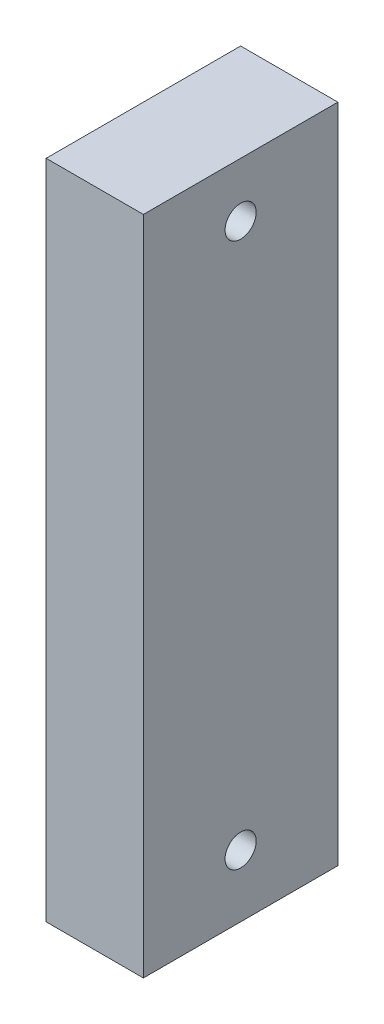
ISO-10303-21;
HEADER;
FILE_DESCRIPTION(('STEP AP214'),'2;1');
FILE_NAME('part.step','',(''),(''),'','','');
FILE_SCHEMA(('AUTOMOTIVE_DESIGN { 1 0 10303 214 1 1 1 1 }'));
ENDSEC;
DATA;
#1=APPLICATION_CONTEXT('core data for automotive mechanical design processes');
#2=APPLICATION_PROTOCOL_DEFINITION('international standard','automotive_design',2000,#1);
#3=PRODUCT_CONTEXT('',#1,'mechanical');
#4=PRODUCT('Part','Part','',(#3));
#5=PRODUCT_RELATED_PRODUCT_CATEGORY('part','',(#4));
#6=PRODUCT_DEFINITION_FORMATION('','',#4);
#7=PRODUCT_DEFINITION_CONTEXT('part definition',#1,'design');
#8=PRODUCT_DEFINITION('design','',#6,#7);
#9=PRODUCT_DEFINITION_SHAPE('','',#8);
#10=(LENGTH_UNIT() NAMED_UNIT(*) SI_UNIT(.MILLI.,.METRE.));
#11=(NAMED_UNIT(*) PLANE_ANGLE_UNIT() SI_UNIT($,.RADIAN.));
#12=(NAMED_UNIT(*) SI_UNIT($,.STERADIAN.) SOLID_ANGLE_UNIT());
#13=UNCERTAINTY_MEASURE_WITH_UNIT(LENGTH_MEASURE(1.E-05),#10,'distance_accuracy_value','');
#14=(GEOMETRIC_REPRESENTATION_CONTEXT(3) GLOBAL_UNCERTAINTY_ASSIGNED_CONTEXT((#13)) GLOBAL_UNIT_ASSIGNED_CONTEXT((#10,
#11,#12)) REPRESENTATION_CONTEXT('',''));
#15=CARTESIAN_POINT('',(0.,0.,0.));
#16=DIRECTION('',(0.,0.,1.));
#17=DIRECTION('',(1.,0.,0.));
#18=AXIS2_PLACEMENT_3D('',#15,#16,#17);
#19=CARTESIAN_POINT('',(0.,0.,50.));
#20=DIRECTION('',(1.,0.,0.));
#21=DIRECTION('',(0.,0.,-1.));
#22=AXIS2_PLACEMENT_3D('',#19,#20,#21);
#23=PLANE('',#22);
#24=CARTESIAN_POINT('',(0.,156.,24.9999999999995));
#25=DIRECTION('',(-1.,0.,0.));
#26=DIRECTION('',(0.,0.,1.));
#27=AXIS2_PLACEMENT_3D('',#24,#25,#26);
#28=CIRCLE('',#27,4.);
#29=CARTESIAN_POINT('',(0.,156.,28.9999999999995));
#30=VERTEX_POINT('',#29);
#31=EDGE_CURVE('E116',#30,#30,#28,.T.);
#32=ORIENTED_EDGE('',*,*,#31,.F.);
#33=EDGE_LOOP('',(#32));
#34=FACE_BOUND('',#33,.T.);
#35=CARTESIAN_POINT('',(0.,16.,25.));
#36=DIRECTION('',(-1.,0.,0.));
#37=DIRECTION('',(0.,0.,1.));
#38=AXIS2_PLACEMENT_3D('',#35,#36,#37);
#39=CIRCLE('',#38,4.);
#40=CARTESIAN_POINT('',(0.,16.,29.));
#41=VERTEX_POINT('',#40);
#42=EDGE_CURVE('E110',#41,#41,#39,.T.);
#43=ORIENTED_EDGE('',*,*,#42,.F.);
#44=EDGE_LOOP('',(#43));
#45=FACE_BOUND('',#44,.T.);
#46=DIRECTION('',(0.,-1.,0.));
#47=VECTOR('',#46,1.);
#48=CARTESIAN_POINT('',(0.,0.,0.));
#49=LINE('',#48,#47);
#50=CARTESIAN_POINT('',(0.,170.,0.));
#51=VERTEX_POINT('',#50);
#52=CARTESIAN_POINT('',(0.,0.,0.));
#53=VERTEX_POINT('',#52);
#54=EDGE_CURVE('E96',#51,#53,#49,.T.);
#55=ORIENTED_EDGE('',*,*,#54,.T.);
#56=DIRECTION('',(0.,0.,-1.));
#57=VECTOR('',#56,1.);
#58=CARTESIAN_POINT('',(0.,0.,50.));
#59=LINE('',#58,#57);
#60=CARTESIAN_POINT('',(0.,0.,50.));
#61=VERTEX_POINT('',#60);
#62=EDGE_CURVE('E11',#61,#53,#59,.T.);
#63=ORIENTED_EDGE('',*,*,#62,.F.);
#64=DIRECTION('',(0.,-1.,0.));
#65=VECTOR('',#64,1.);
#66=CARTESIAN_POINT('',(0.,0.,50.));
#67=LINE('',#66,#65);
#68=CARTESIAN_POINT('',(0.,170.,50.));
#69=VERTEX_POINT('',#68);
#70=EDGE_CURVE('E84',#69,#61,#67,.T.);
#71=ORIENTED_EDGE('',*,*,#70,.F.);
#72=DIRECTION('',(0.,0.,-1.));
#73=VECTOR('',#72,1.);
#74=CARTESIAN_POINT('',(0.,170.,50.));
#75=LINE('',#74,#73);
#76=EDGE_CURVE('E92',#69,#51,#75,.T.);
#77=ORIENTED_EDGE('',*,*,#76,.T.);
#78=EDGE_LOOP('',(#55,#63,#71,#77));
#79=FACE_BOUND('',#78,.T.);
#80=ADVANCED_FACE('F33',(#34,#45,#79),#23,.F.);
#81=CARTESIAN_POINT('',(0.,0.,50.));
#82=DIRECTION('',(0.,1.,0.));
#83=DIRECTION('',(0.,0.,1.));
#84=AXIS2_PLACEMENT_3D('',#81,#82,#83);
#85=PLANE('',#84);
#86=DIRECTION('',(1.,0.,0.));
#87=VECTOR('',#86,1.);
#88=CARTESIAN_POINT('',(0.,0.,0.));
#89=LINE('',#88,#87);
#90=CARTESIAN_POINT('',(25.,0.,0.));
#91=VERTEX_POINT('',#90);
#92=EDGE_CURVE('E88',#53,#91,#89,.T.);
#93=ORIENTED_EDGE('',*,*,#92,.T.);
#94=DIRECTION('',(0.,0.,-1.));
#95=VECTOR('',#94,1.);
#96=CARTESIAN_POINT('',(25.,0.,50.));
#97=LINE('',#96,#95);
#98=CARTESIAN_POINT('',(25.,0.,50.));
#99=VERTEX_POINT('',#98);
#100=EDGE_CURVE('E41',#99,#91,#97,.T.);
#101=ORIENTED_EDGE('',*,*,#100,.F.);
#102=DIRECTION('',(1.,0.,0.));
#103=VECTOR('',#102,1.);
#104=CARTESIAN_POINT('',(0.,0.,50.));
#105=LINE('',#104,#103);
#106=EDGE_CURVE('E79',#61,#99,#105,.T.);
#107=ORIENTED_EDGE('',*,*,#106,.F.);
#108=ORIENTED_EDGE('',*,*,#62,.T.);
#109=EDGE_LOOP('',(#93,#101,#107,#108));
#110=FACE_BOUND('',#109,.T.);
#111=ADVANCED_FACE('F87',(#110),#85,.F.);
#112=CARTESIAN_POINT('',(25.,0.,50.));
#113=DIRECTION('',(-1.,0.,0.));
#114=DIRECTION('',(0.,-1.,0.));
#115=AXIS2_PLACEMENT_3D('',#112,#113,#114);
#116=PLANE('',#115);
#117=CARTESIAN_POINT('',(25.,156.,24.9999999999995));
#118=DIRECTION('',(-1.,0.,0.));
#119=DIRECTION('',(0.,0.,1.));
#120=AXIS2_PLACEMENT_3D('',#117,#118,#119);
#121=CIRCLE('',#120,4.);
#122=CARTESIAN_POINT('',(25.,156.,28.9999999999995));
#123=VERTEX_POINT('',#122);
#124=EDGE_CURVE('E113',#123,#123,#121,.T.);
#125=ORIENTED_EDGE('',*,*,#124,.T.);
#126=EDGE_LOOP('',(#125));
#127=FACE_BOUND('',#126,.T.);
#128=CARTESIAN_POINT('',(25.,16.,25.));
#129=DIRECTION('',(-1.,0.,0.));
#130=DIRECTION('',(0.,0.,1.));
#131=AXIS2_PLACEMENT_3D('',#128,#129,#130);
#132=CIRCLE('',#131,4.);
#133=CARTESIAN_POINT('',(25.,16.,29.));
#134=VERTEX_POINT('',#133);
#135=EDGE_CURVE('E99',#134,#134,#132,.T.);
#136=ORIENTED_EDGE('',*,*,#135,.T.);
#137=EDGE_LOOP('',(#136));
#138=FACE_BOUND('',#137,.T.);
#139=DIRECTION('',(0.,1.,0.));
#140=VECTOR('',#139,1.);
#141=CARTESIAN_POINT('',(25.,0.,0.));
#142=LINE('',#141,#140);
#143=CARTESIAN_POINT('',(25.,170.,0.));
#144=VERTEX_POINT('',#143);
#145=EDGE_CURVE('E66',#91,#144,#142,.T.);
#146=ORIENTED_EDGE('',*,*,#145,.T.);
#147=DIRECTION('',(0.,0.,-1.));
#148=VECTOR('',#147,1.);
#149=CARTESIAN_POINT('',(25.,170.,50.));
#150=LINE('',#149,#148);
#151=CARTESIAN_POINT('',(25.,170.,50.));
#152=VERTEX_POINT('',#151);
#153=EDGE_CURVE('E89',#152,#144,#150,.T.);
#154=ORIENTED_EDGE('',*,*,#153,.F.);
#155=DIRECTION('',(0.,1.,0.));
#156=VECTOR('',#155,1.);
#157=CARTESIAN_POINT('',(25.,0.,50.));
#158=LINE('',#157,#156);
#159=EDGE_CURVE('E82',#99,#152,#158,.T.);
#160=ORIENTED_EDGE('',*,*,#159,.F.);
#161=ORIENTED_EDGE('',*,*,#100,.T.);
#162=EDGE_LOOP('',(#146,#154,#160,#161));
#163=FACE_BOUND('',#162,.T.);
#164=ADVANCED_FACE('F90',(#127,#138,#163),#116,.F.);
#165=CARTESIAN_POINT('',(0.,170.,50.));
#166=DIRECTION('',(0.,-1.,0.));
#167=DIRECTION('',(0.,0.,-1.));
#168=AXIS2_PLACEMENT_3D('',#165,#166,#167);
#169=PLANE('',#168);
#170=DIRECTION('',(-1.,0.,0.));
#171=VECTOR('',#170,1.);
#172=CARTESIAN_POINT('',(0.,170.,0.));
#173=LINE('',#172,#171);
#174=EDGE_CURVE('E72',#144,#51,#173,.T.);
#175=ORIENTED_EDGE('',*,*,#174,.T.);
#176=ORIENTED_EDGE('',*,*,#76,.F.);
#177=DIRECTION('',(-1.,0.,0.));
#178=VECTOR('',#177,1.);
#179=CARTESIAN_POINT('',(0.,170.,50.));
#180=LINE('',#179,#178);
#181=EDGE_CURVE('E49',#152,#69,#180,.T.);
#182=ORIENTED_EDGE('',*,*,#181,.F.);
#183=ORIENTED_EDGE('',*,*,#153,.T.);
#184=EDGE_LOOP('',(#175,#176,#182,#183));
#185=FACE_BOUND('',#184,.T.);
#186=ADVANCED_FACE('F104',(#185),#169,.F.);
#187=CARTESIAN_POINT('',(0.,0.,50.));
#188=DIRECTION('',(0.,0.,-1.));
#189=DIRECTION('',(-1.,0.,0.));
#190=AXIS2_PLACEMENT_3D('',#187,#188,#189);
#191=PLANE('',#190);
#192=ORIENTED_EDGE('',*,*,#70,.T.);
#193=ORIENTED_EDGE('',*,*,#106,.T.);
#194=ORIENTED_EDGE('',*,*,#159,.T.);
#195=ORIENTED_EDGE('',*,*,#181,.T.);
#196=EDGE_LOOP('',(#192,#193,#194,#195));
#197=FACE_BOUND('',#196,.T.);
#198=ADVANCED_FACE('F80',(#197),#191,.F.);
#199=CARTESIAN_POINT('',(0.,0.,0.));
#200=DIRECTION('',(0.,0.,-1.));
#201=DIRECTION('',(-1.,0.,0.));
#202=AXIS2_PLACEMENT_3D('',#199,#200,#201);
#203=PLANE('',#202);
#204=ORIENTED_EDGE('',*,*,#54,.F.);
#205=ORIENTED_EDGE('',*,*,#174,.F.);
#206=ORIENTED_EDGE('',*,*,#145,.F.);
#207=ORIENTED_EDGE('',*,*,#92,.F.);
#208=EDGE_LOOP('',(#204,#205,#206,#207));
#209=FACE_BOUND('',#208,.T.);
#210=ADVANCED_FACE('F107',(#209),#203,.T.);
#211=CARTESIAN_POINT('',(25.,16.,25.));
#212=DIRECTION('',(-1.,0.,0.));
#213=DIRECTION('',(0.,0.,1.));
#214=AXIS2_PLACEMENT_3D('',#211,#212,#213);
#215=CYLINDRICAL_SURFACE('',#214,4.);
#216=CARTESIAN_POINT('',(25.,16.,29.));
#217=CARTESIAN_POINT('',(24.7395833333333,16.,29.));
#218=CARTESIAN_POINT('',(24.4791666666667,16.,29.));
#219=CARTESIAN_POINT('',(23.9583333333333,16.,29.));
#220=CARTESIAN_POINT('',(23.6979166666667,16.,29.));
#221=CARTESIAN_POINT('',(23.1770833333333,16.,29.));
#222=CARTESIAN_POINT('',(22.9166666666667,16.,29.));
#223=CARTESIAN_POINT('',(22.3958333333333,16.,29.));
#224=CARTESIAN_POINT('',(22.1354166666667,16.,29.));
#225=CARTESIAN_POINT('',(21.6145833333333,16.,29.));
#226=CARTESIAN_POINT('',(21.3541666666667,16.,29.));
#227=CARTESIAN_POINT('',(20.8333333333333,16.,29.));
#228=CARTESIAN_POINT('',(20.5729166666667,16.,29.));
#229=CARTESIAN_POINT('',(20.0520833333333,16.,29.));
#230=CARTESIAN_POINT('',(19.7916666666667,16.,29.));
#231=CARTESIAN_POINT('',(19.2708333333333,16.,29.));
#232=CARTESIAN_POINT('',(19.0104166666667,16.,29.));
#233=CARTESIAN_POINT('',(18.4895833333333,16.,29.));
#234=CARTESIAN_POINT('',(18.2291666666667,16.,29.));
#235=CARTESIAN_POINT('',(17.7083333333333,16.,29.));
#236=CARTESIAN_POINT('',(17.4479166666667,16.,29.));
#237=CARTESIAN_POINT('',(16.9270833333333,16.,29.));
#238=CARTESIAN_POINT('',(16.6666666666667,16.,29.));
#239=CARTESIAN_POINT('',(16.1458333333333,16.,29.));
#240=CARTESIAN_POINT('',(15.8854166666667,16.,29.));
#241=CARTESIAN_POINT('',(15.3645833333333,16.,29.));
#242=CARTESIAN_POINT('',(15.1041666666667,16.,29.));
#243=CARTESIAN_POINT('',(14.5833333333333,16.,29.));
#244=CARTESIAN_POINT('',(14.3229166666667,16.,29.));
#245=CARTESIAN_POINT('',(13.8020833333333,16.,29.));
#246=CARTESIAN_POINT('',(13.5416666666667,16.,29.));
#247=CARTESIAN_POINT('',(13.0208333333333,16.,29.));
#248=CARTESIAN_POINT('',(12.7604166666667,16.,29.));
#249=CARTESIAN_POINT('',(12.2395833333333,16.,29.));
#250=CARTESIAN_POINT('',(11.9791666666667,16.,29.));
#251=CARTESIAN_POINT('',(11.4583333333333,16.,29.));
#252=CARTESIAN_POINT('',(11.1979166666667,16.,29.));
#253=CARTESIAN_POINT('',(10.6770833333333,16.,29.));
#254=CARTESIAN_POINT('',(10.4166666666667,16.,29.));
#255=CARTESIAN_POINT('',(9.89583333333333,16.,29.));
#256=CARTESIAN_POINT('',(9.63541666666667,16.,29.));
#257=CARTESIAN_POINT('',(9.11458333333333,16.,29.));
#258=CARTESIAN_POINT('',(8.85416666666667,16.,29.));
#259=CARTESIAN_POINT('',(8.33333333333333,16.,29.));
#260=CARTESIAN_POINT('',(8.07291666666667,16.,29.));
#261=CARTESIAN_POINT('',(7.55208333333333,16.,29.));
#262=CARTESIAN_POINT('',(7.29166666666667,16.,29.));
#263=CARTESIAN_POINT('',(6.77083333333333,16.,29.));
#264=CARTESIAN_POINT('',(6.51041666666667,16.,29.));
#265=CARTESIAN_POINT('',(5.98958333333333,16.,29.));
#266=CARTESIAN_POINT('',(5.72916666666667,16.,29.));
#267=CARTESIAN_POINT('',(5.20833333333333,16.,29.));
#268=CARTESIAN_POINT('',(4.94791666666667,16.,29.));
#269=CARTESIAN_POINT('',(4.42708333333333,16.,29.));
#270=CARTESIAN_POINT('',(4.16666666666667,16.,29.));
#271=CARTESIAN_POINT('',(3.64583333333333,16.,29.));
#272=CARTESIAN_POINT('',(3.38541666666667,16.,29.));
#273=CARTESIAN_POINT('',(2.86458333333333,16.,29.));
#274=CARTESIAN_POINT('',(2.60416666666667,16.,29.));
#275=CARTESIAN_POINT('',(2.08333333333333,16.,29.));
#276=CARTESIAN_POINT('',(1.82291666666667,16.,29.));
#277=CARTESIAN_POINT('',(1.30208333333333,16.,29.));
#278=CARTESIAN_POINT('',(1.04166666666667,16.,29.));
#279=CARTESIAN_POINT('',(0.520833333333334,16.,29.));
#280=CARTESIAN_POINT('',(0.260416666666667,16.,29.));
#281=CARTESIAN_POINT('',(0.,16.,29.));
#282=B_SPLINE_CURVE_WITH_KNOTS('',3,(#216,#217,#218,#219,#220,#221,#222,#223,#224,#225,#226,
#227,#228,#229,#230,#231,#232,#233,#234,#235,#236,#237,#238,#239,#240,#241,#242,#243,#244,#245,
#246,#247,#248,#249,#250,#251,#252,#253,#254,#255,#256,#257,#258,#259,#260,#261,#262,#263,#264,
#265,#266,#267,#268,#269,#270,#271,#272,#273,#274,#275,#276,#277,#278,#279,#280,#281),
.UNSPECIFIED.,.F.,.F.,(4,2,2,2,2,2,2,2,2,2,2,2,2,2,2,2,2,2,2,2,2,2,2,2,2,2,2,2,2,2,2,2,4),(0.,
0.781249999999997,1.5625,2.34375,3.125,3.90625,4.6875,5.46875,6.25,7.03125,7.8125,8.59375,9.375,
10.15625,10.9375,11.71875,12.5,13.28125,14.0625,14.84375,15.625,16.40625,17.1875,17.96875,18.75,
19.53125,20.3125,21.09375,21.875,22.65625,23.4375,24.21875,25.),.UNSPECIFIED.);
#283=EDGE_CURVE('BSEAM127',#134,#41,#282,.T.);
#284=ORIENTED_EDGE('',*,*,#135,.F.);
#285=ORIENTED_EDGE('',*,*,#42,.T.);
#286=ORIENTED_EDGE('',*,*,#283,.T.);
#287=ORIENTED_EDGE('',*,*,#283,.F.);
#288=EDGE_LOOP('',(#284,#286,#285,#287));
#289=FACE_BOUND('',#288,.T.);
#290=ADVANCED_FACE('F127',(#289),#215,.F.);
#291=CARTESIAN_POINT('',(25.,156.,24.9999999999995));
#292=DIRECTION('',(-1.,0.,0.));
#293=DIRECTION('',(0.,0.,1.));
#294=AXIS2_PLACEMENT_3D('',#291,#292,#293);
#295=CYLINDRICAL_SURFACE('',#294,4.);
#296=CARTESIAN_POINT('',(25.,156.,28.9999999999995));
#297=CARTESIAN_POINT('',(24.7395833333333,156.,28.9999999999995));
#298=CARTESIAN_POINT('',(24.4791666666667,156.,28.9999999999995));
#299=CARTESIAN_POINT('',(23.9583333333333,156.,28.9999999999995));
#300=CARTESIAN_POINT('',(23.6979166666667,156.,28.9999999999995));
#301=CARTESIAN_POINT('',(23.1770833333333,156.,28.9999999999995));
#302=CARTESIAN_POINT('',(22.9166666666667,156.,28.9999999999995));
#303=CARTESIAN_POINT('',(22.3958333333333,156.,28.9999999999995));
#304=CARTESIAN_POINT('',(22.1354166666667,156.,28.9999999999995));
#305=CARTESIAN_POINT('',(21.6145833333333,156.,28.9999999999995));
#306=CARTESIAN_POINT('',(21.3541666666667,156.,28.9999999999995));
#307=CARTESIAN_POINT('',(20.8333333333333,156.,28.9999999999995));
#308=CARTESIAN_POINT('',(20.5729166666667,156.,28.9999999999995));
#309=CARTESIAN_POINT('',(20.0520833333333,156.,28.9999999999995));
#310=CARTESIAN_POINT('',(19.7916666666667,156.,28.9999999999995));
#311=CARTESIAN_POINT('',(19.2708333333333,156.,28.9999999999995));
#312=CARTESIAN_POINT('',(19.0104166666667,156.,28.9999999999995));
#313=CARTESIAN_POINT('',(18.4895833333333,156.,28.9999999999995));
#314=CARTESIAN_POINT('',(18.2291666666667,156.,28.9999999999995));
#315=CARTESIAN_POINT('',(17.7083333333333,156.,28.9999999999995));
#316=CARTESIAN_POINT('',(17.4479166666667,156.,28.9999999999995));
#317=CARTESIAN_POINT('',(16.9270833333333,156.,28.9999999999995));
#318=CARTESIAN_POINT('',(16.6666666666667,156.,28.9999999999995));
#319=CARTESIAN_POINT('',(16.1458333333333,156.,28.9999999999995));
#320=CARTESIAN_POINT('',(15.8854166666667,156.,28.9999999999995));
#321=CARTESIAN_POINT('',(15.3645833333333,156.,28.9999999999995));
#322=CARTESIAN_POINT('',(15.1041666666667,156.,28.9999999999995));
#323=CARTESIAN_POINT('',(14.5833333333333,156.,28.9999999999995));
#324=CARTESIAN_POINT('',(14.3229166666667,156.,28.9999999999995));
#325=CARTESIAN_POINT('',(13.8020833333333,156.,28.9999999999995));
#326=CARTESIAN_POINT('',(13.5416666666667,156.,28.9999999999995));
#327=CARTESIAN_POINT('',(13.0208333333333,156.,28.9999999999995));
#328=CARTESIAN_POINT('',(12.7604166666667,156.,28.9999999999995));
#329=CARTESIAN_POINT('',(12.2395833333333,156.,28.9999999999995));
#330=CARTESIAN_POINT('',(11.9791666666667,156.,28.9999999999995));
#331=CARTESIAN_POINT('',(11.4583333333333,156.,28.9999999999995));
#332=CARTESIAN_POINT('',(11.1979166666667,156.,28.9999999999995));
#333=CARTESIAN_POINT('',(10.6770833333333,156.,28.9999999999995));
#334=CARTESIAN_POINT('',(10.4166666666667,156.,28.9999999999995));
#335=CARTESIAN_POINT('',(9.89583333333333,156.,28.9999999999995));
#336=CARTESIAN_POINT('',(9.63541666666667,156.,28.9999999999995));
#337=CARTESIAN_POINT('',(9.11458333333333,156.,28.9999999999995));
#338=CARTESIAN_POINT('',(8.85416666666667,156.,28.9999999999995));
#339=CARTESIAN_POINT('',(8.33333333333333,156.,28.9999999999995));
#340=CARTESIAN_POINT('',(8.07291666666667,156.,28.9999999999995));
#341=CARTESIAN_POINT('',(7.55208333333333,156.,28.9999999999995));
#342=CARTESIAN_POINT('',(7.29166666666667,156.,28.9999999999995));
#343=CARTESIAN_POINT('',(6.77083333333333,156.,28.9999999999995));
#344=CARTESIAN_POINT('',(6.51041666666667,156.,28.9999999999995));
#345=CARTESIAN_POINT('',(5.98958333333333,156.,28.9999999999995));
#346=CARTESIAN_POINT('',(5.72916666666667,156.,28.9999999999995));
#347=CARTESIAN_POINT('',(5.20833333333333,156.,28.9999999999995));
#348=CARTESIAN_POINT('',(4.94791666666667,156.,28.9999999999995));
#349=CARTESIAN_POINT('',(4.42708333333333,156.,28.9999999999995));
#350=CARTESIAN_POINT('',(4.16666666666667,156.,28.9999999999995));
#351=CARTESIAN_POINT('',(3.64583333333333,156.,28.9999999999995));
#352=CARTESIAN_POINT('',(3.38541666666667,156.,28.9999999999995));
#353=CARTESIAN_POINT('',(2.86458333333333,156.,28.9999999999995));
#354=CARTESIAN_POINT('',(2.60416666666667,156.,28.9999999999995));
#355=CARTESIAN_POINT('',(2.08333333333333,156.,28.9999999999995));
#356=CARTESIAN_POINT('',(1.82291666666667,156.,28.9999999999995));
#357=CARTESIAN_POINT('',(1.30208333333333,156.,28.9999999999995));
#358=CARTESIAN_POINT('',(1.04166666666667,156.,28.9999999999995));
#359=CARTESIAN_POINT('',(0.520833333333334,156.,28.9999999999995));
#360=CARTESIAN_POINT('',(0.260416666666667,156.,28.9999999999995));
#361=CARTESIAN_POINT('',(0.,156.,28.9999999999995));
#362=B_SPLINE_CURVE_WITH_KNOTS('',3,(#296,#297,#298,#299,#300,#301,#302,#303,#304,#305,#306,
#307,#308,#309,#310,#311,#312,#313,#314,#315,#316,#317,#318,#319,#320,#321,#322,#323,#324,#325,
#326,#327,#328,#329,#330,#331,#332,#333,#334,#335,#336,#337,#338,#339,#340,#341,#342,#343,#344,
#345,#346,#347,#348,#349,#350,#351,#352,#353,#354,#355,#356,#357,#358,#359,#360,#361),
.UNSPECIFIED.,.F.,.F.,(4,2,2,2,2,2,2,2,2,2,2,2,2,2,2,2,2,2,2,2,2,2,2,2,2,2,2,2,2,2,2,2,4),(0.,
0.781249999999997,1.5625,2.34375,3.125,3.90625,4.6875,5.46875,6.25,7.03125,7.8125,8.59375,9.375,
10.15625,10.9375,11.71875,12.5,13.28125,14.0625,14.84375,15.625,16.40625,17.1875,17.96875,18.75,
19.53125,20.3125,21.09375,21.875,22.65625,23.4375,24.21875,25.),.UNSPECIFIED.);
#363=EDGE_CURVE('BSEAM124',#123,#30,#362,.T.);
#364=ORIENTED_EDGE('',*,*,#124,.F.);
#365=ORIENTED_EDGE('',*,*,#31,.T.);
#366=ORIENTED_EDGE('',*,*,#363,.T.);
#367=ORIENTED_EDGE('',*,*,#363,.F.);
#368=EDGE_LOOP('',(#364,#366,#365,#367));
#369=FACE_BOUND('',#368,.T.);
#370=ADVANCED_FACE('F124',(#369),#295,.F.);
#371=CLOSED_SHELL('',(#80,#111,#164,#186,#198,#210,#290,#370));
#372=MANIFOLD_SOLID_BREP('B2',#371);
#373=ADVANCED_BREP_SHAPE_REPRESENTATION('',(#18,#372),#14);
#374=SHAPE_DEFINITION_REPRESENTATION(#9,#373);
ENDSEC;
END-ISO-10303-21;
